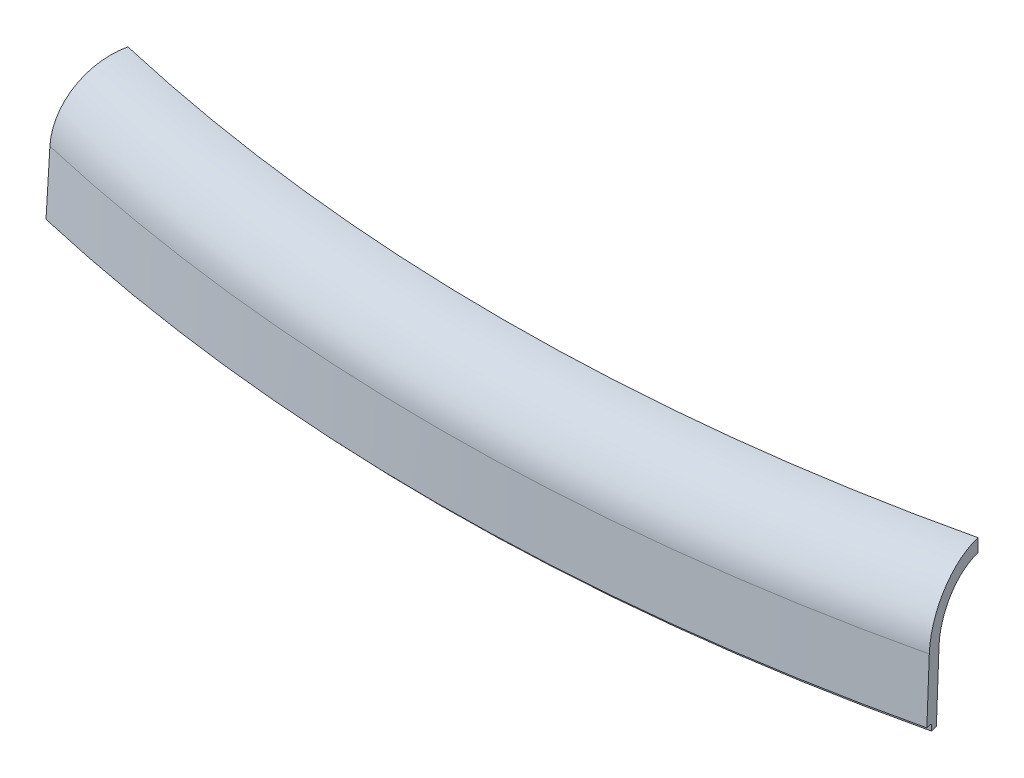
ISO-10303-21;
HEADER;
FILE_DESCRIPTION(('STEP AP214'),'2;1');
FILE_NAME('part.step','',(''),(''),'','','');
FILE_SCHEMA(('AUTOMOTIVE_DESIGN { 1 0 10303 214 1 1 1 1 }'));
ENDSEC;
DATA;
#1=APPLICATION_CONTEXT('core data for automotive mechanical design processes');
#2=APPLICATION_PROTOCOL_DEFINITION('international standard','automotive_design',2000,#1);
#3=PRODUCT_CONTEXT('',#1,'mechanical');
#4=PRODUCT('Part','Part','',(#3));
#5=PRODUCT_RELATED_PRODUCT_CATEGORY('part','',(#4));
#6=PRODUCT_DEFINITION_FORMATION('','',#4);
#7=PRODUCT_DEFINITION_CONTEXT('part definition',#1,'design');
#8=PRODUCT_DEFINITION('design','',#6,#7);
#9=PRODUCT_DEFINITION_SHAPE('','',#8);
#10=(LENGTH_UNIT() NAMED_UNIT(*) SI_UNIT(.MILLI.,.METRE.));
#11=(NAMED_UNIT(*) PLANE_ANGLE_UNIT() SI_UNIT($,.RADIAN.));
#12=(NAMED_UNIT(*) SI_UNIT($,.STERADIAN.) SOLID_ANGLE_UNIT());
#13=UNCERTAINTY_MEASURE_WITH_UNIT(LENGTH_MEASURE(1.E-05),#10,'distance_accuracy_value','');
#14=(GEOMETRIC_REPRESENTATION_CONTEXT(3) GLOBAL_UNCERTAINTY_ASSIGNED_CONTEXT((#13)) GLOBAL_UNIT_ASSIGNED_CONTEXT((#10,
#11,#12)) REPRESENTATION_CONTEXT('',''));
#15=CARTESIAN_POINT('',(0.,0.,0.));
#16=DIRECTION('',(0.,0.,1.));
#17=DIRECTION('',(1.,0.,0.));
#18=AXIS2_PLACEMENT_3D('',#15,#16,#17);
#19=CARTESIAN_POINT('',(0.,0.,0.));
#20=DIRECTION('',(0.,1.,0.));
#21=DIRECTION('',(0.,0.,1.));
#22=AXIS2_PLACEMENT_3D('',#19,#20,#21);
#23=PLANE('',#22);
#24=DIRECTION('',(0.225411918087087,0.,0.974263551193567));
#25=VECTOR('',#24,1.);
#26=CARTESIAN_POINT('',(32.6241147166548,0.,16.0062348438679));
#27=LINE('',#26,#25);
#28=CARTESIAN_POINT('',(33.5860664518322,0.,20.1639321011562));
#29=VERTEX_POINT('',#28);
#30=CARTESIAN_POINT('',(33.6990817540194,0.,20.6524009034384));
#31=VERTEX_POINT('',#30);
#32=EDGE_CURVE('E164',#29,#31,#27,.T.);
#33=ORIENTED_EDGE('',*,*,#32,.T.);
#34=CARTESIAN_POINT('',(0.,0.,-125.));
#35=DIRECTION('',(0.,1.,0.));
#36=DIRECTION('',(0.,0.,1.));
#37=AXIS2_PLACEMENT_3D('',#34,#35,#36);
#38=CIRCLE('',#37,149.5);
#39=CARTESIAN_POINT('',(-33.6990817540195,0.,20.6524009034383));
#40=VERTEX_POINT('',#39);
#41=EDGE_CURVE('E156',#40,#31,#38,.T.);
#42=ORIENTED_EDGE('',*,*,#41,.F.);
#43=DIRECTION('',(-0.225411918087087,0.,0.974263551193567));
#44=VECTOR('',#43,1.);
#45=CARTESIAN_POINT('',(-32.6241147166549,0.,16.0062348438679));
#46=LINE('',#45,#44);
#47=CARTESIAN_POINT('',(-33.5860664518323,0.,20.1639321011562));
#48=VERTEX_POINT('',#47);
#49=EDGE_CURVE('E109',#48,#40,#46,.T.);
#50=ORIENTED_EDGE('',*,*,#49,.F.);
#51=CARTESIAN_POINT('',(0.,0.,-125.));
#52=DIRECTION('',(0.,1.,0.));
#53=DIRECTION('',(-0.225411918087087,0.,0.974263551193567));
#54=AXIS2_PLACEMENT_3D('',#51,#52,#53);
#55=CIRCLE('',#54,148.998627654002);
#56=EDGE_CURVE('E95',#48,#29,#55,.T.);
#57=ORIENTED_EDGE('',*,*,#56,.T.);
#58=EDGE_LOOP('',(#33,#42,#50,#57));
#59=FACE_BOUND('',#58,.T.);
#60=ADVANCED_FACE('F88',(#59),#23,.F.);
#61=CARTESIAN_POINT('',(0.,0.,-125.));
#62=DIRECTION('',(0.,1.,0.));
#63=DIRECTION('',(0.,0.,1.));
#64=AXIS2_PLACEMENT_3D('',#61,#62,#63);
#65=CYLINDRICAL_SURFACE('',#64,144.731099373595);
#66=CARTESIAN_POINT('',(0.,10.,-125.));
#67=DIRECTION('',(0.,1.,0.));
#68=DIRECTION('',(-0.225411918087087,0.,0.974263551193567));
#69=AXIS2_PLACEMENT_3D('',#66,#67,#68);
#70=CIRCLE('',#69,144.731099373595);
#71=CARTESIAN_POINT('',(-32.6241147166549,10.,16.0062348438679));
#72=VERTEX_POINT('',#71);
#73=CARTESIAN_POINT('',(32.6241147166548,10.,16.006234843868));
#74=VERTEX_POINT('',#73);
#75=EDGE_CURVE('E189',#72,#74,#70,.T.);
#76=ORIENTED_EDGE('',*,*,#75,.T.);
#77=DIRECTION('',(0.,1.,0.));
#78=VECTOR('',#77,1.);
#79=CARTESIAN_POINT('',(32.6241147166548,10.,16.0062348438679));
#80=LINE('',#79,#78);
#81=CARTESIAN_POINT('',(32.6241147166548,9.00000000000002,16.006234843868));
#82=VERTEX_POINT('',#81);
#83=EDGE_CURVE('E191',#82,#74,#80,.T.);
#84=ORIENTED_EDGE('',*,*,#83,.F.);
#85=CARTESIAN_POINT('',(0.,9.00000000000002,-125.));
#86=DIRECTION('',(0.,1.,0.));
#87=DIRECTION('',(-0.225411918087087,0.,0.974263551193567));
#88=AXIS2_PLACEMENT_3D('',#85,#86,#87);
#89=CIRCLE('',#88,144.731099373595);
#90=CARTESIAN_POINT('',(-32.6241147166549,9.00000000000002,16.0062348438679));
#91=VERTEX_POINT('',#90);
#92=EDGE_CURVE('E197',#91,#82,#89,.T.);
#93=ORIENTED_EDGE('',*,*,#92,.F.);
#94=DIRECTION('',(0.,1.,0.));
#95=VECTOR('',#94,1.);
#96=CARTESIAN_POINT('',(-32.6241147166549,10.,16.0062348438679));
#97=LINE('',#96,#95);
#98=EDGE_CURVE('E194',#91,#72,#97,.T.);
#99=ORIENTED_EDGE('',*,*,#98,.T.);
#100=EDGE_LOOP('',(#76,#84,#93,#99));
#101=FACE_BOUND('',#100,.T.);
#102=ADVANCED_FACE('F229',(#101),#65,.F.);
#103=CARTESIAN_POINT('',(-32.6241147166549,-5.,16.0062348438679));
#104=DIRECTION('',(0.974263551193567,0.,0.225411918087087));
#105=DIRECTION('',(0.225411918087087,0.,-0.974263551193567));
#106=AXIS2_PLACEMENT_3D('',#103,#104,#105);
#107=PLANE('',#106);
#108=DIRECTION('',(0.0117971482816438,-0.998629534754574,-0.0509890145843615));
#109=VECTOR('',#108,1.);
#110=CARTESIAN_POINT('',(0.,-2852.62993481537,-125.));
#111=LINE('',#110,#109);
#112=CARTESIAN_POINT('',(-33.704988423045,0.5,20.6779303980156));
#113=VERTEX_POINT('',#112);
#114=EDGE_CURVE('E153',#113,#40,#111,.T.);
#115=ORIENTED_EDGE('',*,*,#114,.F.);
#116=DIRECTION('',(-0.225411918087087,0.,0.974263551193567));
#117=VECTOR('',#116,1.);
#118=CARTESIAN_POINT('',(-32.6241147166549,0.5,16.0062348438679));
#119=LINE('',#118,#117);
#120=CARTESIAN_POINT('',(-33.8058810440376,0.5,21.1140031844579));
#121=VERTEX_POINT('',#120);
#122=EDGE_CURVE('E212',#113,#121,#119,.T.);
#123=ORIENTED_EDGE('',*,*,#122,.T.);
#124=DIRECTION('',(-0.0117971482816449,-0.998629534754574,0.0509890145843663));
#125=VECTOR('',#124,1.);
#126=CARTESIAN_POINT('',(-33.7496297110921,5.26167978121472,20.8708766281518));
#127=LINE('',#126,#125);
#128=CARTESIAN_POINT('',(-33.7496297110921,5.26167978121472,20.8708766281518));
#129=VERTEX_POINT('',#128);
#130=EDGE_CURVE('E180',#129,#121,#127,.T.);
#131=ORIENTED_EDGE('',*,*,#130,.F.);
#132=CARTESIAN_POINT('',(-32.6241147166549,5.,16.0062348438679));
#133=DIRECTION('',(0.974263551193567,0.,0.225411918087087));
#134=DIRECTION('',(0.225411918087087,0.,-0.974263551193567));
#135=AXIS2_PLACEMENT_3D('',#132,#133,#134);
#136=CIRCLE('',#135,5.);
#137=EDGE_CURVE('E184',#72,#129,#136,.T.);
#138=ORIENTED_EDGE('',*,*,#137,.F.);
#139=ORIENTED_EDGE('',*,*,#98,.F.);
#140=CARTESIAN_POINT('',(-32.6241147166549,5.,16.0062348438679));
#141=DIRECTION('',(-0.974263551193567,0.,-0.225411918087087));
#142=DIRECTION('',(0.225411918087087,0.,-0.974263551193567));
#143=AXIS2_PLACEMENT_3D('',#140,#141,#142);
#144=CIRCLE('',#143,4.00000000000002);
#145=CARTESIAN_POINT('',(-33.5245267122047,5.20934382497178,19.897948271295));
#146=VERTEX_POINT('',#145);
#147=EDGE_CURVE('E202',#146,#91,#144,.T.);
#148=ORIENTED_EDGE('',*,*,#147,.F.);
#149=DIRECTION('',(0.0117971482816442,0.998629534754574,-0.0509890145843632));
#150=VECTOR('',#149,1.);
#151=CARTESIAN_POINT('',(-33.5245267122047,5.20934382497178,19.897948271295));
#152=LINE('',#151,#150);
#153=EDGE_CURVE('E170',#48,#146,#152,.T.);
#154=ORIENTED_EDGE('',*,*,#153,.F.);
#155=ORIENTED_EDGE('',*,*,#49,.T.);
#156=EDGE_LOOP('',(#115,#123,#131,#138,#139,#148,#154,#155));
#157=FACE_BOUND('',#156,.T.);
#158=ADVANCED_FACE('F168',(#157),#107,.F.);
#159=CARTESIAN_POINT('',(0.,5.,-125.));
#160=DIRECTION('',(0.,1.,0.));
#161=DIRECTION('',(0.,0.,1.));
#162=AXIS2_PLACEMENT_3D('',#159,#160,#161);
#163=TOROIDAL_SURFACE('',#162,144.731099373595,5.);
#164=CARTESIAN_POINT('',(0.,5.26167978121472,-125.));
#165=DIRECTION('',(0.,1.,0.));
#166=DIRECTION('',(-0.225411918087087,0.,0.974263551193567));
#167=AXIS2_PLACEMENT_3D('',#164,#165,#166);
#168=CIRCLE('',#167,149.724247047368);
#169=CARTESIAN_POINT('',(33.749629711092,5.26167978121472,20.8708766281518));
#170=VERTEX_POINT('',#169);
#171=EDGE_CURVE('E185',#129,#170,#168,.T.);
#172=ORIENTED_EDGE('',*,*,#171,.T.);
#173=CARTESIAN_POINT('',(32.6241147166548,5.,16.0062348438679));
#174=DIRECTION('',(0.974263551193567,0.,-0.225411918087086));
#175=DIRECTION('',(-0.225411918087087,0.,-0.974263551193567));
#176=AXIS2_PLACEMENT_3D('',#173,#174,#175);
#177=CIRCLE('',#176,5.);
#178=EDGE_CURVE('E177',#74,#170,#177,.T.);
#179=ORIENTED_EDGE('',*,*,#178,.F.);
#180=ORIENTED_EDGE('',*,*,#75,.F.);
#181=ORIENTED_EDGE('',*,*,#137,.T.);
#182=EDGE_LOOP('',(#172,#179,#180,#181));
#183=FACE_BOUND('',#182,.T.);
#184=ADVANCED_FACE('F225',(#183),#163,.T.);
#185=CARTESIAN_POINT('',(32.6241147166548,-5.,16.0062348438679));
#186=DIRECTION('',(0.974263551193567,0.,-0.225411918087086));
#187=DIRECTION('',(-0.225411918087087,0.,-0.974263551193567));
#188=AXIS2_PLACEMENT_3D('',#185,#186,#187);
#189=PLANE('',#188);
#190=DIRECTION('',(0.225411918087087,0.,0.974263551193567));
#191=VECTOR('',#190,1.);
#192=CARTESIAN_POINT('',(32.6241147166548,0.5,16.0062348438679));
#193=LINE('',#192,#191);
#194=CARTESIAN_POINT('',(33.7049884230449,0.5,20.6779303980156));
#195=VERTEX_POINT('',#194);
#196=CARTESIAN_POINT('',(33.8058810440375,0.5,21.1140031844579));
#197=VERTEX_POINT('',#196);
#198=EDGE_CURVE('E101',#195,#197,#193,.T.);
#199=ORIENTED_EDGE('',*,*,#198,.F.);
#200=DIRECTION('',(-0.0117971482816438,-0.998629534754574,-0.0509890145843616));
#201=VECTOR('',#200,1.);
#202=CARTESIAN_POINT('',(0.,-2852.62993481537,-125.));
#203=LINE('',#202,#201);
#204=EDGE_CURVE('E161',#195,#31,#203,.T.);
#205=ORIENTED_EDGE('',*,*,#204,.T.);
#206=ORIENTED_EDGE('',*,*,#32,.F.);
#207=DIRECTION('',(-0.0117971482816442,0.998629534754574,-0.0509890145843632));
#208=VECTOR('',#207,1.);
#209=CARTESIAN_POINT('',(33.5245267122046,5.20934382497178,19.897948271295));
#210=LINE('',#209,#208);
#211=CARTESIAN_POINT('',(33.5245267122046,5.20934382497178,19.897948271295));
#212=VERTEX_POINT('',#211);
#213=EDGE_CURVE('E188',#29,#212,#210,.T.);
#214=ORIENTED_EDGE('',*,*,#213,.T.);
#215=CARTESIAN_POINT('',(32.6241147166548,5.,16.0062348438679));
#216=DIRECTION('',(-0.974263551193567,0.,0.225411918087086));
#217=DIRECTION('',(-0.225411918087087,0.,-0.974263551193567));
#218=AXIS2_PLACEMENT_3D('',#215,#216,#217);
#219=CIRCLE('',#218,4.00000000000002);
#220=EDGE_CURVE('E199',#212,#82,#219,.T.);
#221=ORIENTED_EDGE('',*,*,#220,.T.);
#222=ORIENTED_EDGE('',*,*,#83,.T.);
#223=ORIENTED_EDGE('',*,*,#178,.T.);
#224=DIRECTION('',(0.0117971482816449,-0.998629534754574,0.0509890145843663));
#225=VECTOR('',#224,1.);
#226=CARTESIAN_POINT('',(33.749629711092,5.26167978121472,20.8708766281518));
#227=LINE('',#226,#225);
#228=EDGE_CURVE('E172',#170,#197,#227,.T.);
#229=ORIENTED_EDGE('',*,*,#228,.T.);
#230=EDGE_LOOP('',(#199,#205,#206,#214,#221,#222,#223,#229));
#231=FACE_BOUND('',#230,.T.);
#232=ADVANCED_FACE('F218',(#231),#189,.T.);
#233=CARTESIAN_POINT('',(0.,5.26167978121472,-125.));
#234=DIRECTION('',(0.,-1.,0.));
#235=DIRECTION('',(0.,0.,-1.));
#236=AXIS2_PLACEMENT_3D('',#233,#234,#235);
#237=CONICAL_SURFACE('',#236,149.724247047368,0.052359877559834);
#238=CARTESIAN_POINT('',(0.,0.5,-125.));
#239=DIRECTION('',(0.,1.,0.));
#240=DIRECTION('',(0.,0.,1.));
#241=AXIS2_PLACEMENT_3D('',#238,#239,#240);
#242=CIRCLE('',#241,149.973796110359);
#243=EDGE_CURVE('E15',#197,#121,#242,.F.);
#244=ORIENTED_EDGE('',*,*,#243,.F.);
#245=ORIENTED_EDGE('',*,*,#228,.F.);
#246=ORIENTED_EDGE('',*,*,#171,.F.);
#247=ORIENTED_EDGE('',*,*,#130,.T.);
#248=EDGE_LOOP('',(#244,#245,#246,#247));
#249=FACE_BOUND('',#248,.T.);
#250=ADVANCED_FACE('F223',(#249),#237,.T.);
#251=CARTESIAN_POINT('',(0.,5.,-125.));
#252=DIRECTION('',(0.,1.,0.));
#253=DIRECTION('',(0.,0.,1.));
#254=AXIS2_PLACEMENT_3D('',#251,#252,#253);
#255=TOROIDAL_SURFACE('',#254,144.731099373595,4.00000000000002);
#256=ORIENTED_EDGE('',*,*,#92,.T.);
#257=ORIENTED_EDGE('',*,*,#220,.F.);
#258=CARTESIAN_POINT('',(0.,5.20934382497178,-125.));
#259=DIRECTION('',(0.,1.,0.));
#260=DIRECTION('',(-0.225411918087087,0.,0.974263551193567));
#261=AXIS2_PLACEMENT_3D('',#258,#259,#260);
#262=CIRCLE('',#261,148.725617512614);
#263=EDGE_CURVE('E183',#146,#212,#262,.T.);
#264=ORIENTED_EDGE('',*,*,#263,.F.);
#265=ORIENTED_EDGE('',*,*,#147,.T.);
#266=EDGE_LOOP('',(#256,#257,#264,#265));
#267=FACE_BOUND('',#266,.T.);
#268=ADVANCED_FACE('F233',(#267),#255,.F.);
#269=CARTESIAN_POINT('',(0.,0.,-125.));
#270=DIRECTION('',(0.,-1.,0.));
#271=DIRECTION('',(0.,0.,-1.));
#272=AXIS2_PLACEMENT_3D('',#269,#270,#271);
#273=CONICAL_SURFACE('',#272,148.998627654002,0.0523598775598335);
#274=ORIENTED_EDGE('',*,*,#263,.T.);
#275=ORIENTED_EDGE('',*,*,#213,.F.);
#276=ORIENTED_EDGE('',*,*,#56,.F.);
#277=ORIENTED_EDGE('',*,*,#153,.T.);
#278=EDGE_LOOP('',(#274,#275,#276,#277));
#279=FACE_BOUND('',#278,.T.);
#280=ADVANCED_FACE('F236',(#279),#273,.F.);
#281=CARTESIAN_POINT('',(0.,0.5,0.));
#282=DIRECTION('',(0.,1.,0.));
#283=DIRECTION('',(0.,0.,1.));
#284=AXIS2_PLACEMENT_3D('',#281,#282,#283);
#285=PLANE('',#284);
#286=CARTESIAN_POINT('',(0.,0.5,-125.));
#287=DIRECTION('',(0.,1.,0.));
#288=DIRECTION('',(0.,0.,1.));
#289=AXIS2_PLACEMENT_3D('',#286,#287,#288);
#290=CIRCLE('',#289,149.526203889642);
#291=EDGE_CURVE('E158',#113,#195,#290,.T.);
#292=ORIENTED_EDGE('',*,*,#291,.T.);
#293=ORIENTED_EDGE('',*,*,#198,.T.);
#294=ORIENTED_EDGE('',*,*,#243,.T.);
#295=ORIENTED_EDGE('',*,*,#122,.F.);
#296=EDGE_LOOP('',(#292,#293,#294,#295));
#297=FACE_BOUND('',#296,.T.);
#298=ADVANCED_FACE('F239',(#297),#285,.F.);
#299=CARTESIAN_POINT('',(0.,0.,-125.));
#300=DIRECTION('',(0.,1.,0.));
#301=DIRECTION('',(0.,0.,1.));
#302=AXIS2_PLACEMENT_3D('',#299,#300,#301);
#303=CONICAL_SURFACE('',#302,149.5,0.0523598775598298);
#304=ORIENTED_EDGE('',*,*,#41,.T.);
#305=ORIENTED_EDGE('',*,*,#204,.F.);
#306=ORIENTED_EDGE('',*,*,#291,.F.);
#307=ORIENTED_EDGE('',*,*,#114,.T.);
#308=EDGE_LOOP('',(#304,#305,#306,#307));
#309=FACE_BOUND('',#308,.T.);
#310=ADVANCED_FACE('F154',(#309),#303,.T.);
#311=CLOSED_SHELL('',(#60,#102,#158,#184,#232,#250,#268,#280,#298,#310));
#312=MANIFOLD_SOLID_BREP('B2',#311);
#313=ADVANCED_BREP_SHAPE_REPRESENTATION('',(#18,#312),#14);
#314=SHAPE_DEFINITION_REPRESENTATION(#9,#313);
ENDSEC;
END-ISO-10303-21;
